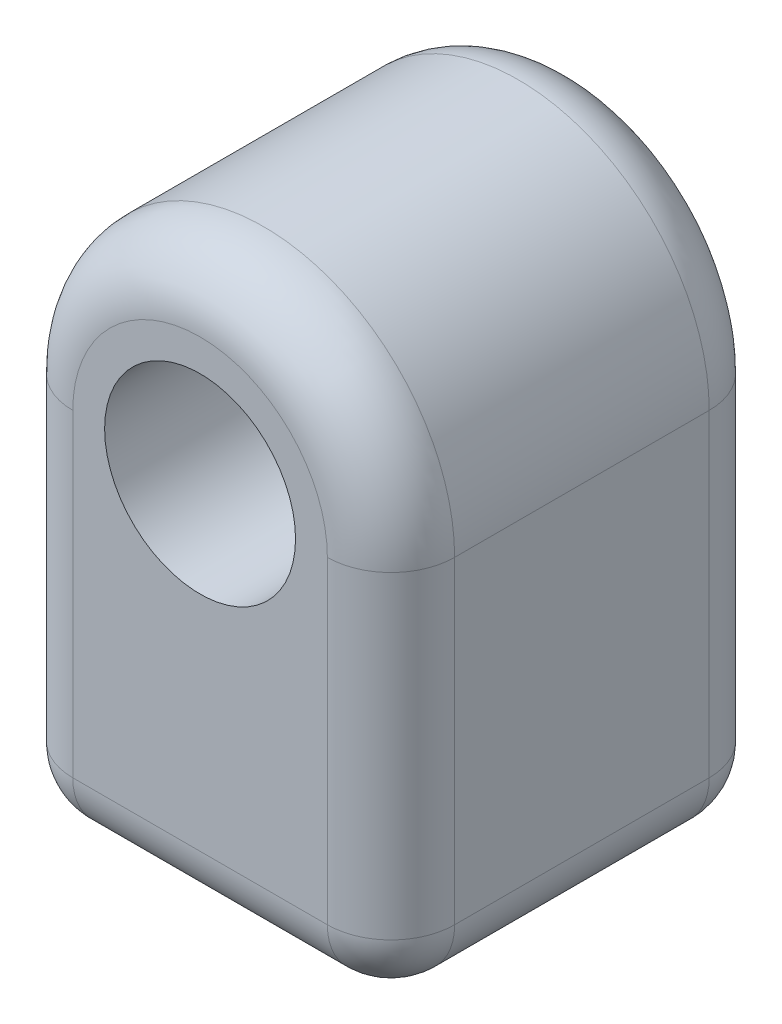
ISO-10303-21;
HEADER;
FILE_DESCRIPTION(('STEP AP214'),'2;1');
FILE_NAME('part.step','',(''),(''),'','','');
FILE_SCHEMA(('AUTOMOTIVE_DESIGN { 1 0 10303 214 1 1 1 1 }'));
ENDSEC;
DATA;
#1=APPLICATION_CONTEXT('core data for automotive mechanical design processes');
#2=APPLICATION_PROTOCOL_DEFINITION('international standard','automotive_design',2000,#1);
#3=PRODUCT_CONTEXT('',#1,'mechanical');
#4=PRODUCT('Part','Part','',(#3));
#5=PRODUCT_RELATED_PRODUCT_CATEGORY('part','',(#4));
#6=PRODUCT_DEFINITION_FORMATION('','',#4);
#7=PRODUCT_DEFINITION_CONTEXT('part definition',#1,'design');
#8=PRODUCT_DEFINITION('design','',#6,#7);
#9=PRODUCT_DEFINITION_SHAPE('','',#8);
#10=(LENGTH_UNIT() NAMED_UNIT(*) SI_UNIT(.MILLI.,.METRE.));
#11=(NAMED_UNIT(*) PLANE_ANGLE_UNIT() SI_UNIT($,.RADIAN.));
#12=(NAMED_UNIT(*) SI_UNIT($,.STERADIAN.) SOLID_ANGLE_UNIT());
#13=UNCERTAINTY_MEASURE_WITH_UNIT(LENGTH_MEASURE(1.E-05),#10,'distance_accuracy_value','');
#14=(GEOMETRIC_REPRESENTATION_CONTEXT(3) GLOBAL_UNCERTAINTY_ASSIGNED_CONTEXT((#13)) GLOBAL_UNIT_ASSIGNED_CONTEXT((#10,
#11,#12)) REPRESENTATION_CONTEXT('',''));
#15=CARTESIAN_POINT('',(0.,0.,0.));
#16=DIRECTION('',(0.,0.,1.));
#17=DIRECTION('',(1.,0.,0.));
#18=AXIS2_PLACEMENT_3D('',#15,#16,#17);
#19=CARTESIAN_POINT('',(0.,0.,6.));
#20=DIRECTION('',(0.,0.,1.));
#21=DIRECTION('',(1.,0.,0.));
#22=AXIS2_PLACEMENT_3D('',#19,#20,#21);
#23=PLANE('',#22);
#24=DIRECTION('',(0.,1.,0.));
#25=VECTOR('',#24,1.);
#26=CARTESIAN_POINT('',(2.,0.,6.));
#27=LINE('',#26,#25);
#28=CARTESIAN_POINT('',(2.,-5.,6.));
#29=VERTEX_POINT('',#28);
#30=CARTESIAN_POINT('',(2.,0.,6.));
#31=VERTEX_POINT('',#30);
#32=EDGE_CURVE('E204',#29,#31,#27,.T.);
#33=ORIENTED_EDGE('',*,*,#32,.T.);
#34=CARTESIAN_POINT('',(0.,0.,6.));
#35=DIRECTION('',(0.,0.,1.));
#36=DIRECTION('',(1.,0.,0.));
#37=AXIS2_PLACEMENT_3D('',#34,#35,#36);
#38=CIRCLE('',#37,2.);
#39=CARTESIAN_POINT('',(-2.,0.,6.));
#40=VERTEX_POINT('',#39);
#41=EDGE_CURVE('E208',#31,#40,#38,.T.);
#42=ORIENTED_EDGE('',*,*,#41,.T.);
#43=DIRECTION('',(0.,-1.,0.));
#44=VECTOR('',#43,1.);
#45=CARTESIAN_POINT('',(-2.,-6.,6.));
#46=LINE('',#45,#44);
#47=CARTESIAN_POINT('',(-2.,-5.,6.));
#48=VERTEX_POINT('',#47);
#49=EDGE_CURVE('E206',#40,#48,#46,.T.);
#50=ORIENTED_EDGE('',*,*,#49,.T.);
#51=DIRECTION('',(1.,0.,0.));
#52=VECTOR('',#51,1.);
#53=CARTESIAN_POINT('',(3.,-5.,6.));
#54=LINE('',#53,#52);
#55=EDGE_CURVE('E202',#48,#29,#54,.T.);
#56=ORIENTED_EDGE('',*,*,#55,.T.);
#57=EDGE_LOOP('',(#33,#42,#50,#56));
#58=FACE_BOUND('',#57,.T.);
#59=CARTESIAN_POINT('',(0.,0.,6.));
#60=DIRECTION('',(0.,0.,1.));
#61=DIRECTION('',(1.,0.,0.));
#62=AXIS2_PLACEMENT_3D('',#59,#60,#61);
#63=CIRCLE('',#62,1.5);
#64=CARTESIAN_POINT('',(1.5,0.,6.));
#65=VERTEX_POINT('',#64);
#66=EDGE_CURVE('E169',#65,#65,#63,.T.);
#67=ORIENTED_EDGE('',*,*,#66,.F.);
#68=EDGE_LOOP('',(#67));
#69=FACE_BOUND('',#68,.T.);
#70=ADVANCED_FACE('F33',(#58,#69),#23,.T.);
#71=CARTESIAN_POINT('',(0.,0.,0.));
#72=DIRECTION('',(0.,0.,1.));
#73=DIRECTION('',(1.,0.,0.));
#74=AXIS2_PLACEMENT_3D('',#71,#72,#73);
#75=PLANE('',#74);
#76=DIRECTION('',(0.,-1.,0.));
#77=VECTOR('',#76,1.);
#78=CARTESIAN_POINT('',(-2.,0.,0.));
#79=LINE('',#78,#77);
#80=CARTESIAN_POINT('',(-2.,-5.,0.));
#81=VERTEX_POINT('',#80);
#82=CARTESIAN_POINT('',(-2.,0.,0.));
#83=VERTEX_POINT('',#82);
#84=EDGE_CURVE('E193',#81,#83,#79,.F.);
#85=ORIENTED_EDGE('',*,*,#84,.T.);
#86=CARTESIAN_POINT('',(0.,0.,0.));
#87=DIRECTION('',(0.,0.,1.));
#88=DIRECTION('',(1.,0.,0.));
#89=AXIS2_PLACEMENT_3D('',#86,#87,#88);
#90=CIRCLE('',#89,2.);
#91=CARTESIAN_POINT('',(2.,0.,0.));
#92=VERTEX_POINT('',#91);
#93=EDGE_CURVE('E199',#83,#92,#90,.F.);
#94=ORIENTED_EDGE('',*,*,#93,.T.);
#95=DIRECTION('',(0.,1.,0.));
#96=VECTOR('',#95,1.);
#97=CARTESIAN_POINT('',(2.,0.,0.));
#98=LINE('',#97,#96);
#99=CARTESIAN_POINT('',(2.,-5.,0.));
#100=VERTEX_POINT('',#99);
#101=EDGE_CURVE('E197',#92,#100,#98,.F.);
#102=ORIENTED_EDGE('',*,*,#101,.T.);
#103=DIRECTION('',(1.,0.,0.));
#104=VECTOR('',#103,1.);
#105=CARTESIAN_POINT('',(0.,-5.,0.));
#106=LINE('',#105,#104);
#107=EDGE_CURVE('E195',#100,#81,#106,.F.);
#108=ORIENTED_EDGE('',*,*,#107,.T.);
#109=EDGE_LOOP('',(#85,#94,#102,#108));
#110=FACE_BOUND('',#109,.T.);
#111=DIRECTION('',(-1.,0.,0.));
#112=VECTOR('',#111,1.);
#113=CARTESIAN_POINT('',(1.25,-3.5,0.));
#114=LINE('',#113,#112);
#115=CARTESIAN_POINT('',(1.25,-3.5,0.));
#116=VERTEX_POINT('',#115);
#117=CARTESIAN_POINT('',(-1.25,-3.5,0.));
#118=VERTEX_POINT('',#117);
#119=EDGE_CURVE('E149',#116,#118,#114,.T.);
#120=ORIENTED_EDGE('',*,*,#119,.F.);
#121=DIRECTION('',(0.,-1.,0.));
#122=VECTOR('',#121,1.);
#123=CARTESIAN_POINT('',(1.25,-2.,0.));
#124=LINE('',#123,#122);
#125=CARTESIAN_POINT('',(1.25,-2.,0.));
#126=VERTEX_POINT('',#125);
#127=EDGE_CURVE('E154',#126,#116,#124,.T.);
#128=ORIENTED_EDGE('',*,*,#127,.F.);
#129=DIRECTION('',(1.,0.,0.));
#130=VECTOR('',#129,1.);
#131=CARTESIAN_POINT('',(1.25,-2.,0.));
#132=LINE('',#131,#130);
#133=CARTESIAN_POINT('',(-1.25,-2.,0.));
#134=VERTEX_POINT('',#133);
#135=EDGE_CURVE('E159',#134,#126,#132,.T.);
#136=ORIENTED_EDGE('',*,*,#135,.F.);
#137=DIRECTION('',(0.,1.,0.));
#138=VECTOR('',#137,1.);
#139=CARTESIAN_POINT('',(-1.25,-2.,0.));
#140=LINE('',#139,#138);
#141=EDGE_CURVE('E138',#118,#134,#140,.T.);
#142=ORIENTED_EDGE('',*,*,#141,.F.);
#143=EDGE_LOOP('',(#120,#128,#136,#142));
#144=FACE_BOUND('',#143,.T.);
#145=CARTESIAN_POINT('',(0.,0.,0.));
#146=DIRECTION('',(0.,0.,1.));
#147=DIRECTION('',(1.,0.,0.));
#148=AXIS2_PLACEMENT_3D('',#145,#146,#147);
#149=CIRCLE('',#148,1.5);
#150=CARTESIAN_POINT('',(1.5,0.,0.));
#151=VERTEX_POINT('',#150);
#152=EDGE_CURVE('E166',#151,#151,#149,.T.);
#153=ORIENTED_EDGE('',*,*,#152,.T.);
#154=EDGE_LOOP('',(#153));
#155=FACE_BOUND('',#154,.T.);
#156=ADVANCED_FACE('F156',(#110,#144,#155),#75,.F.);
#157=CARTESIAN_POINT('',(0.,0.,6.));
#158=DIRECTION('',(0.,0.,-1.));
#159=DIRECTION('',(-1.,0.,0.));
#160=AXIS2_PLACEMENT_3D('',#157,#158,#159);
#161=CYLINDRICAL_SURFACE('',#160,3.);
#162=DIRECTION('',(0.,0.,-1.));
#163=VECTOR('',#162,1.);
#164=CARTESIAN_POINT('',(3.,0.,6.));
#165=LINE('',#164,#163);
#166=CARTESIAN_POINT('',(3.,0.,5.));
#167=VERTEX_POINT('',#166);
#168=CARTESIAN_POINT('',(3.,0.,1.));
#169=VERTEX_POINT('',#168);
#170=EDGE_CURVE('E172',#167,#169,#165,.T.);
#171=ORIENTED_EDGE('',*,*,#170,.T.);
#172=CARTESIAN_POINT('',(0.,0.,1.));
#173=DIRECTION('',(0.,0.,1.));
#174=DIRECTION('',(1.,0.,0.));
#175=AXIS2_PLACEMENT_3D('',#172,#173,#174);
#176=CIRCLE('',#175,3.);
#177=CARTESIAN_POINT('',(-3.,0.,1.));
#178=VERTEX_POINT('',#177);
#179=EDGE_CURVE('E190',#169,#178,#176,.T.);
#180=ORIENTED_EDGE('',*,*,#179,.T.);
#181=DIRECTION('',(0.,0.,-1.));
#182=VECTOR('',#181,1.);
#183=CARTESIAN_POINT('',(-3.,0.,6.));
#184=LINE('',#183,#182);
#185=CARTESIAN_POINT('',(-3.,0.,5.));
#186=VERTEX_POINT('',#185);
#187=EDGE_CURVE('E177',#186,#178,#184,.T.);
#188=ORIENTED_EDGE('',*,*,#187,.F.);
#189=CARTESIAN_POINT('',(0.,0.,5.));
#190=DIRECTION('',(0.,0.,1.));
#191=DIRECTION('',(1.,0.,0.));
#192=AXIS2_PLACEMENT_3D('',#189,#190,#191);
#193=CIRCLE('',#192,3.);
#194=EDGE_CURVE('E188',#186,#167,#193,.F.);
#195=ORIENTED_EDGE('',*,*,#194,.T.);
#196=EDGE_LOOP('',(#171,#180,#188,#195));
#197=FACE_BOUND('',#196,.T.);
#198=ADVANCED_FACE('F294',(#197),#161,.T.);
#199=CARTESIAN_POINT('',(-3.,0.,6.));
#200=DIRECTION('',(1.,0.,0.));
#201=DIRECTION('',(0.,1.,0.));
#202=AXIS2_PLACEMENT_3D('',#199,#200,#201);
#203=PLANE('',#202);
#204=ORIENTED_EDGE('',*,*,#187,.T.);
#205=DIRECTION('',(0.,-1.,0.));
#206=VECTOR('',#205,1.);
#207=CARTESIAN_POINT('',(-3.,0.,1.));
#208=LINE('',#207,#206);
#209=CARTESIAN_POINT('',(-3.,-5.,1.));
#210=VERTEX_POINT('',#209);
#211=EDGE_CURVE('E11',#178,#210,#208,.T.);
#212=ORIENTED_EDGE('',*,*,#211,.T.);
#213=DIRECTION('',(0.,0.,-1.));
#214=VECTOR('',#213,1.);
#215=CARTESIAN_POINT('',(-3.,-5.,6.));
#216=LINE('',#215,#214);
#217=CARTESIAN_POINT('',(-3.,-5.,5.));
#218=VERTEX_POINT('',#217);
#219=EDGE_CURVE('E49',#210,#218,#216,.F.);
#220=ORIENTED_EDGE('',*,*,#219,.T.);
#221=DIRECTION('',(0.,-1.,0.));
#222=VECTOR('',#221,1.);
#223=CARTESIAN_POINT('',(-3.,0.,5.));
#224=LINE('',#223,#222);
#225=EDGE_CURVE('E42',#218,#186,#224,.F.);
#226=ORIENTED_EDGE('',*,*,#225,.T.);
#227=EDGE_LOOP('',(#204,#212,#220,#226));
#228=FACE_BOUND('',#227,.T.);
#229=ADVANCED_FACE('F284',(#228),#203,.F.);
#230=CARTESIAN_POINT('',(-3.,-6.,6.));
#231=DIRECTION('',(0.,1.,0.));
#232=DIRECTION('',(0.,0.,1.));
#233=AXIS2_PLACEMENT_3D('',#230,#231,#232);
#234=PLANE('',#233);
#235=DIRECTION('',(0.,0.,-1.));
#236=VECTOR('',#235,1.);
#237=CARTESIAN_POINT('',(-2.,-6.,6.));
#238=LINE('',#237,#236);
#239=CARTESIAN_POINT('',(-2.,-6.,5.));
#240=VERTEX_POINT('',#239);
#241=CARTESIAN_POINT('',(-2.,-6.,1.));
#242=VERTEX_POINT('',#241);
#243=EDGE_CURVE('E219',#240,#242,#238,.T.);
#244=ORIENTED_EDGE('',*,*,#243,.T.);
#245=DIRECTION('',(1.,0.,0.));
#246=VECTOR('',#245,1.);
#247=CARTESIAN_POINT('',(-3.,-6.,1.));
#248=LINE('',#247,#246);
#249=CARTESIAN_POINT('',(2.,-6.,1.));
#250=VERTEX_POINT('',#249);
#251=EDGE_CURVE('E223',#242,#250,#248,.T.);
#252=ORIENTED_EDGE('',*,*,#251,.T.);
#253=DIRECTION('',(0.,0.,-1.));
#254=VECTOR('',#253,1.);
#255=CARTESIAN_POINT('',(2.,-6.,6.));
#256=LINE('',#255,#254);
#257=CARTESIAN_POINT('',(2.,-6.,5.));
#258=VERTEX_POINT('',#257);
#259=EDGE_CURVE('E221',#250,#258,#256,.F.);
#260=ORIENTED_EDGE('',*,*,#259,.T.);
#261=DIRECTION('',(1.,0.,0.));
#262=VECTOR('',#261,1.);
#263=CARTESIAN_POINT('',(-3.,-6.,5.));
#264=LINE('',#263,#262);
#265=EDGE_CURVE('E217',#258,#240,#264,.F.);
#266=ORIENTED_EDGE('',*,*,#265,.T.);
#267=EDGE_LOOP('',(#244,#252,#260,#266));
#268=FACE_BOUND('',#267,.T.);
#269=DIRECTION('',(1.,0.,0.));
#270=VECTOR('',#269,1.);
#271=CARTESIAN_POINT('',(-3.,-6.,4.00000000000005));
#272=LINE('',#271,#270);
#273=CARTESIAN_POINT('',(-1.25,-6.,4.00000000000005));
#274=VERTEX_POINT('',#273);
#275=CARTESIAN_POINT('',(1.25,-6.,4.00000000000005));
#276=VERTEX_POINT('',#275);
#277=EDGE_CURVE('E182',#274,#276,#272,.T.);
#278=ORIENTED_EDGE('',*,*,#277,.T.);
#279=DIRECTION('',(0.,0.,-1.));
#280=VECTOR('',#279,1.);
#281=CARTESIAN_POINT('',(1.25,-6.,6.));
#282=LINE('',#281,#280);
#283=CARTESIAN_POINT('',(1.25,-6.,2.50000000000003));
#284=VERTEX_POINT('',#283);
#285=EDGE_CURVE('E185',#276,#284,#282,.T.);
#286=ORIENTED_EDGE('',*,*,#285,.T.);
#287=DIRECTION('',(-1.,0.,0.));
#288=VECTOR('',#287,1.);
#289=CARTESIAN_POINT('',(-3.,-6.,2.50000000000003));
#290=LINE('',#289,#288);
#291=CARTESIAN_POINT('',(-1.25,-6.,2.50000000000003));
#292=VERTEX_POINT('',#291);
#293=EDGE_CURVE('E179',#284,#292,#290,.T.);
#294=ORIENTED_EDGE('',*,*,#293,.T.);
#295=DIRECTION('',(0.,0.,1.));
#296=VECTOR('',#295,1.);
#297=CARTESIAN_POINT('',(-1.25,-6.,6.));
#298=LINE('',#297,#296);
#299=EDGE_CURVE('E141',#292,#274,#298,.T.);
#300=ORIENTED_EDGE('',*,*,#299,.T.);
#301=EDGE_LOOP('',(#278,#286,#294,#300));
#302=FACE_BOUND('',#301,.T.);
#303=ADVANCED_FACE('F281',(#268,#302),#234,.F.);
#304=CARTESIAN_POINT('',(3.,-6.,6.));
#305=DIRECTION('',(-1.,0.,0.));
#306=DIRECTION('',(0.,-1.,0.));
#307=AXIS2_PLACEMENT_3D('',#304,#305,#306);
#308=PLANE('',#307);
#309=DIRECTION('',(0.,0.,-1.));
#310=VECTOR('',#309,1.);
#311=CARTESIAN_POINT('',(3.,-5.,6.));
#312=LINE('',#311,#310);
#313=CARTESIAN_POINT('',(3.,-5.,5.));
#314=VERTEX_POINT('',#313);
#315=CARTESIAN_POINT('',(3.,-5.,1.));
#316=VERTEX_POINT('',#315);
#317=EDGE_CURVE('E211',#314,#316,#312,.T.);
#318=ORIENTED_EDGE('',*,*,#317,.T.);
#319=DIRECTION('',(0.,1.,0.));
#320=VECTOR('',#319,1.);
#321=CARTESIAN_POINT('',(3.,-6.,1.));
#322=LINE('',#321,#320);
#323=EDGE_CURVE('E215',#316,#169,#322,.T.);
#324=ORIENTED_EDGE('',*,*,#323,.T.);
#325=ORIENTED_EDGE('',*,*,#170,.F.);
#326=DIRECTION('',(0.,1.,0.));
#327=VECTOR('',#326,1.);
#328=CARTESIAN_POINT('',(3.,-6.,5.));
#329=LINE('',#328,#327);
#330=EDGE_CURVE('E213',#167,#314,#329,.F.);
#331=ORIENTED_EDGE('',*,*,#330,.T.);
#332=EDGE_LOOP('',(#318,#324,#325,#331));
#333=FACE_BOUND('',#332,.T.);
#334=ADVANCED_FACE('F283',(#333),#308,.F.);
#335=CARTESIAN_POINT('',(0.,0.,6.));
#336=DIRECTION('',(0.,0.,-1.));
#337=DIRECTION('',(-1.,0.,0.));
#338=AXIS2_PLACEMENT_3D('',#335,#336,#337);
#339=CYLINDRICAL_SURFACE('',#338,1.5);
#340=ORIENTED_EDGE('',*,*,#66,.T.);
#341=EDGE_LOOP('',(#340));
#342=FACE_BOUND('',#341,.T.);
#343=ORIENTED_EDGE('',*,*,#152,.F.);
#344=EDGE_LOOP('',(#343));
#345=FACE_BOUND('',#344,.T.);
#346=ADVANCED_FACE('F291',(#342,#345),#339,.F.);
#347=CARTESIAN_POINT('',(1.25,-6.24264068711926,4.24264068711931));
#348=DIRECTION('',(1.,0.,0.));
#349=DIRECTION('',(0.,1.,0.));
#350=AXIS2_PLACEMENT_3D('',#347,#348,#349);
#351=PLANE('',#350);
#352=DIRECTION('',(0.,0.707106781186544,-0.707106781186551));
#353=VECTOR('',#352,1.);
#354=CARTESIAN_POINT('',(1.25,-6.24264068711926,4.24264068711931));
#355=LINE('',#354,#353);
#356=EDGE_CURVE('E164',#276,#126,#355,.T.);
#357=ORIENTED_EDGE('',*,*,#356,.T.);
#358=ORIENTED_EDGE('',*,*,#127,.T.);
#359=DIRECTION('',(0.,0.707106781186544,-0.707106781186551));
#360=VECTOR('',#359,1.);
#361=CARTESIAN_POINT('',(1.25,-7.74264068711926,4.24264068711931));
#362=LINE('',#361,#360);
#363=EDGE_CURVE('E145',#284,#116,#362,.T.);
#364=ORIENTED_EDGE('',*,*,#363,.F.);
#365=ORIENTED_EDGE('',*,*,#285,.F.);
#366=EDGE_LOOP('',(#357,#358,#364,#365));
#367=FACE_BOUND('',#366,.T.);
#368=ADVANCED_FACE('F276',(#367),#351,.F.);
#369=CARTESIAN_POINT('',(1.25,-6.24264068711926,4.24264068711931));
#370=DIRECTION('',(0.,0.707106781186551,0.707106781186544));
#371=DIRECTION('',(0.,-0.707106781186544,0.707106781186551));
#372=AXIS2_PLACEMENT_3D('',#369,#370,#371);
#373=PLANE('',#372);
#374=DIRECTION('',(0.,0.707106781186544,-0.707106781186551));
#375=VECTOR('',#374,1.);
#376=CARTESIAN_POINT('',(-1.25,-6.24264068711926,4.24264068711931));
#377=LINE('',#376,#375);
#378=EDGE_CURVE('E144',#274,#134,#377,.T.);
#379=ORIENTED_EDGE('',*,*,#378,.T.);
#380=ORIENTED_EDGE('',*,*,#135,.T.);
#381=ORIENTED_EDGE('',*,*,#356,.F.);
#382=ORIENTED_EDGE('',*,*,#277,.F.);
#383=EDGE_LOOP('',(#379,#380,#381,#382));
#384=FACE_BOUND('',#383,.T.);
#385=ADVANCED_FACE('F279',(#384),#373,.F.);
#386=CARTESIAN_POINT('',(-1.25,-6.24264068711926,4.24264068711931));
#387=DIRECTION('',(-1.,0.,0.));
#388=DIRECTION('',(0.,-1.,0.));
#389=AXIS2_PLACEMENT_3D('',#386,#387,#388);
#390=PLANE('',#389);
#391=DIRECTION('',(0.,0.707106781186544,-0.707106781186551));
#392=VECTOR('',#391,1.);
#393=CARTESIAN_POINT('',(-1.25,-7.74264068711926,4.24264068711931));
#394=LINE('',#393,#392);
#395=EDGE_CURVE('E133',#292,#118,#394,.T.);
#396=ORIENTED_EDGE('',*,*,#395,.T.);
#397=ORIENTED_EDGE('',*,*,#141,.T.);
#398=ORIENTED_EDGE('',*,*,#378,.F.);
#399=ORIENTED_EDGE('',*,*,#299,.F.);
#400=EDGE_LOOP('',(#396,#397,#398,#399));
#401=FACE_BOUND('',#400,.T.);
#402=ADVANCED_FACE('F135',(#401),#390,.F.);
#403=CARTESIAN_POINT('',(1.25,-7.74264068711926,4.24264068711931));
#404=DIRECTION('',(0.,-0.707106781186551,-0.707106781186544));
#405=DIRECTION('',(0.,0.707106781186544,-0.707106781186551));
#406=AXIS2_PLACEMENT_3D('',#403,#404,#405);
#407=PLANE('',#406);
#408=ORIENTED_EDGE('',*,*,#363,.T.);
#409=ORIENTED_EDGE('',*,*,#119,.T.);
#410=ORIENTED_EDGE('',*,*,#395,.F.);
#411=ORIENTED_EDGE('',*,*,#293,.F.);
#412=EDGE_LOOP('',(#408,#409,#410,#411));
#413=FACE_BOUND('',#412,.T.);
#414=ADVANCED_FACE('F150',(#413),#407,.F.);
#415=CARTESIAN_POINT('',(0.,0.,5.));
#416=DIRECTION('',(0.,0.,1.));
#417=DIRECTION('',(1.,0.,0.));
#418=AXIS2_PLACEMENT_3D('',#415,#416,#417);
#419=TOROIDAL_SURFACE('',#418,2.,1.);
#420=CARTESIAN_POINT('',(-2.,0.,5.));
#421=DIRECTION('',(0.,-1.,0.));
#422=DIRECTION('',(0.,0.,-1.));
#423=AXIS2_PLACEMENT_3D('',#420,#421,#422);
#424=CIRCLE('',#423,1.);
#425=EDGE_CURVE('E266',#40,#186,#424,.T.);
#426=ORIENTED_EDGE('',*,*,#425,.F.);
#427=ORIENTED_EDGE('',*,*,#41,.F.);
#428=CARTESIAN_POINT('',(2.,0.,5.));
#429=DIRECTION('',(0.,-1.,0.));
#430=DIRECTION('',(0.,0.,-1.));
#431=AXIS2_PLACEMENT_3D('',#428,#429,#430);
#432=CIRCLE('',#431,1.);
#433=EDGE_CURVE('E37',#167,#31,#432,.T.);
#434=ORIENTED_EDGE('',*,*,#433,.F.);
#435=ORIENTED_EDGE('',*,*,#194,.F.);
#436=EDGE_LOOP('',(#426,#427,#434,#435));
#437=FACE_BOUND('',#436,.T.);
#438=ADVANCED_FACE('F35',(#437),#419,.T.);
#439=CARTESIAN_POINT('',(2.,0.,5.));
#440=DIRECTION('',(0.,-1.,0.));
#441=DIRECTION('',(1.,0.,0.));
#442=AXIS2_PLACEMENT_3D('',#439,#440,#441);
#443=CYLINDRICAL_SURFACE('',#442,1.);
#444=ORIENTED_EDGE('',*,*,#433,.T.);
#445=ORIENTED_EDGE('',*,*,#32,.F.);
#446=CARTESIAN_POINT('',(2.,-5.,5.));
#447=DIRECTION('',(0.,-1.,0.));
#448=DIRECTION('',(0.,0.,-1.));
#449=AXIS2_PLACEMENT_3D('',#446,#447,#448);
#450=CIRCLE('',#449,1.);
#451=EDGE_CURVE('E261',#314,#29,#450,.T.);
#452=ORIENTED_EDGE('',*,*,#451,.F.);
#453=ORIENTED_EDGE('',*,*,#330,.F.);
#454=EDGE_LOOP('',(#444,#445,#452,#453));
#455=FACE_BOUND('',#454,.T.);
#456=ADVANCED_FACE('F334',(#455),#443,.T.);
#457=CARTESIAN_POINT('',(-2.,0.,5.));
#458=DIRECTION('',(0.,1.,0.));
#459=DIRECTION('',(-1.,0.,0.));
#460=AXIS2_PLACEMENT_3D('',#457,#458,#459);
#461=CYLINDRICAL_SURFACE('',#460,1.);
#462=ORIENTED_EDGE('',*,*,#425,.T.);
#463=ORIENTED_EDGE('',*,*,#225,.F.);
#464=CARTESIAN_POINT('',(-2.,-5.,5.));
#465=DIRECTION('',(0.,-1.,0.));
#466=DIRECTION('',(0.,0.,-1.));
#467=AXIS2_PLACEMENT_3D('',#464,#465,#466);
#468=CIRCLE('',#467,1.);
#469=EDGE_CURVE('E258',#48,#218,#468,.T.);
#470=ORIENTED_EDGE('',*,*,#469,.F.);
#471=ORIENTED_EDGE('',*,*,#49,.F.);
#472=EDGE_LOOP('',(#462,#463,#470,#471));
#473=FACE_BOUND('',#472,.T.);
#474=ADVANCED_FACE('F342',(#473),#461,.T.);
#475=CARTESIAN_POINT('',(0.,-5.,5.));
#476=DIRECTION('',(-1.,0.,0.));
#477=DIRECTION('',(0.,0.,1.));
#478=AXIS2_PLACEMENT_3D('',#475,#476,#477);
#479=CYLINDRICAL_SURFACE('',#478,1.);
#480=CARTESIAN_POINT('',(2.,-5.,5.));
#481=DIRECTION('',(1.,0.,0.));
#482=DIRECTION('',(0.,0.,-1.));
#483=AXIS2_PLACEMENT_3D('',#480,#481,#482);
#484=CIRCLE('',#483,1.);
#485=EDGE_CURVE('E264',#29,#258,#484,.T.);
#486=ORIENTED_EDGE('',*,*,#485,.F.);
#487=ORIENTED_EDGE('',*,*,#55,.F.);
#488=CARTESIAN_POINT('',(-2.,-5.,5.));
#489=DIRECTION('',(-1.,0.,0.));
#490=DIRECTION('',(0.,0.,1.));
#491=AXIS2_PLACEMENT_3D('',#488,#489,#490);
#492=CIRCLE('',#491,1.);
#493=EDGE_CURVE('E255',#240,#48,#492,.T.);
#494=ORIENTED_EDGE('',*,*,#493,.F.);
#495=ORIENTED_EDGE('',*,*,#265,.F.);
#496=EDGE_LOOP('',(#486,#487,#494,#495));
#497=FACE_BOUND('',#496,.T.);
#498=ADVANCED_FACE('F348',(#497),#479,.T.);
#499=CARTESIAN_POINT('',(2.,-5.,5.));
#500=DIRECTION('',(0.,0.,1.));
#501=DIRECTION('',(1.,0.,0.));
#502=AXIS2_PLACEMENT_3D('',#499,#500,#501);
#503=SPHERICAL_SURFACE('',#502,1.);
#504=ORIENTED_EDGE('',*,*,#451,.T.);
#505=ORIENTED_EDGE('',*,*,#485,.T.);
#506=CARTESIAN_POINT('',(2.,-5.,5.));
#507=DIRECTION('',(0.,0.,1.));
#508=DIRECTION('',(1.,0.,0.));
#509=AXIS2_PLACEMENT_3D('',#506,#507,#508);
#510=CIRCLE('',#509,1.);
#511=EDGE_CURVE('E252',#314,#258,#510,.F.);
#512=ORIENTED_EDGE('',*,*,#511,.F.);
#513=EDGE_LOOP('',(#504,#505,#512));
#514=FACE_BOUND('',#513,.T.);
#515=ADVANCED_FACE('F355',(#514),#503,.T.);
#516=CARTESIAN_POINT('',(-2.,-5.,5.));
#517=DIRECTION('',(0.,0.,1.));
#518=DIRECTION('',(1.,0.,0.));
#519=AXIS2_PLACEMENT_3D('',#516,#517,#518);
#520=SPHERICAL_SURFACE('',#519,1.);
#521=ORIENTED_EDGE('',*,*,#493,.T.);
#522=ORIENTED_EDGE('',*,*,#469,.T.);
#523=CARTESIAN_POINT('',(-2.,-5.,5.));
#524=DIRECTION('',(0.,0.,1.));
#525=DIRECTION('',(1.,0.,0.));
#526=AXIS2_PLACEMENT_3D('',#523,#524,#525);
#527=CIRCLE('',#526,1.);
#528=EDGE_CURVE('E249',#240,#218,#527,.F.);
#529=ORIENTED_EDGE('',*,*,#528,.F.);
#530=EDGE_LOOP('',(#521,#522,#529));
#531=FACE_BOUND('',#530,.T.);
#532=ADVANCED_FACE('F363',(#531),#520,.T.);
#533=CARTESIAN_POINT('',(2.,-5.,6.));
#534=DIRECTION('',(0.,0.,-1.));
#535=DIRECTION('',(-1.,0.,0.));
#536=AXIS2_PLACEMENT_3D('',#533,#534,#535);
#537=CYLINDRICAL_SURFACE('',#536,1.);
#538=ORIENTED_EDGE('',*,*,#511,.T.);
#539=ORIENTED_EDGE('',*,*,#259,.F.);
#540=CARTESIAN_POINT('',(2.,-5.,1.));
#541=DIRECTION('',(0.,0.,-1.));
#542=DIRECTION('',(-1.,0.,0.));
#543=AXIS2_PLACEMENT_3D('',#540,#541,#542);
#544=CIRCLE('',#543,1.);
#545=EDGE_CURVE('E244',#316,#250,#544,.T.);
#546=ORIENTED_EDGE('',*,*,#545,.F.);
#547=ORIENTED_EDGE('',*,*,#317,.F.);
#548=EDGE_LOOP('',(#538,#539,#546,#547));
#549=FACE_BOUND('',#548,.T.);
#550=ADVANCED_FACE('F371',(#549),#537,.T.);
#551=CARTESIAN_POINT('',(-2.,-5.,6.));
#552=DIRECTION('',(0.,0.,-1.));
#553=DIRECTION('',(-1.,0.,0.));
#554=AXIS2_PLACEMENT_3D('',#551,#552,#553);
#555=CYLINDRICAL_SURFACE('',#554,1.);
#556=ORIENTED_EDGE('',*,*,#528,.T.);
#557=ORIENTED_EDGE('',*,*,#219,.F.);
#558=CARTESIAN_POINT('',(-2.,-5.,1.));
#559=DIRECTION('',(0.,0.,-1.));
#560=DIRECTION('',(-1.,0.,0.));
#561=AXIS2_PLACEMENT_3D('',#558,#559,#560);
#562=CIRCLE('',#561,1.);
#563=EDGE_CURVE('E241',#242,#210,#562,.T.);
#564=ORIENTED_EDGE('',*,*,#563,.F.);
#565=ORIENTED_EDGE('',*,*,#243,.F.);
#566=EDGE_LOOP('',(#556,#557,#564,#565));
#567=FACE_BOUND('',#566,.T.);
#568=ADVANCED_FACE('F379',(#567),#555,.T.);
#569=CARTESIAN_POINT('',(-3.,-5.,1.));
#570=DIRECTION('',(1.,0.,0.));
#571=DIRECTION('',(0.,0.,-1.));
#572=AXIS2_PLACEMENT_3D('',#569,#570,#571);
#573=CYLINDRICAL_SURFACE('',#572,1.);
#574=CARTESIAN_POINT('',(2.,-5.,1.));
#575=DIRECTION('',(1.,0.,0.));
#576=DIRECTION('',(0.,0.,-1.));
#577=AXIS2_PLACEMENT_3D('',#574,#575,#576);
#578=CIRCLE('',#577,1.);
#579=EDGE_CURVE('E246',#250,#100,#578,.T.);
#580=ORIENTED_EDGE('',*,*,#579,.F.);
#581=ORIENTED_EDGE('',*,*,#251,.F.);
#582=CARTESIAN_POINT('',(-2.,-5.,1.));
#583=DIRECTION('',(-1.,0.,0.));
#584=DIRECTION('',(0.,0.,1.));
#585=AXIS2_PLACEMENT_3D('',#582,#583,#584);
#586=CIRCLE('',#585,1.);
#587=EDGE_CURVE('E238',#81,#242,#586,.T.);
#588=ORIENTED_EDGE('',*,*,#587,.F.);
#589=ORIENTED_EDGE('',*,*,#107,.F.);
#590=EDGE_LOOP('',(#580,#581,#588,#589));
#591=FACE_BOUND('',#590,.T.);
#592=ADVANCED_FACE('F387',(#591),#573,.T.);
#593=CARTESIAN_POINT('',(2.,-5.,1.));
#594=DIRECTION('',(0.,0.,1.));
#595=DIRECTION('',(1.,0.,0.));
#596=AXIS2_PLACEMENT_3D('',#593,#594,#595);
#597=SPHERICAL_SURFACE('',#596,1.);
#598=ORIENTED_EDGE('',*,*,#545,.T.);
#599=ORIENTED_EDGE('',*,*,#579,.T.);
#600=CARTESIAN_POINT('',(2.,-5.,1.));
#601=DIRECTION('',(0.,-1.,0.));
#602=DIRECTION('',(0.,0.,-1.));
#603=AXIS2_PLACEMENT_3D('',#600,#601,#602);
#604=CIRCLE('',#603,1.);
#605=EDGE_CURVE('E235',#316,#100,#604,.F.);
#606=ORIENTED_EDGE('',*,*,#605,.F.);
#607=EDGE_LOOP('',(#598,#599,#606));
#608=FACE_BOUND('',#607,.T.);
#609=ADVANCED_FACE('F395',(#608),#597,.T.);
#610=CARTESIAN_POINT('',(-2.,-5.,1.));
#611=DIRECTION('',(0.,0.,1.));
#612=DIRECTION('',(1.,0.,0.));
#613=AXIS2_PLACEMENT_3D('',#610,#611,#612);
#614=SPHERICAL_SURFACE('',#613,1.);
#615=ORIENTED_EDGE('',*,*,#587,.T.);
#616=ORIENTED_EDGE('',*,*,#563,.T.);
#617=CARTESIAN_POINT('',(-2.,-5.,1.));
#618=DIRECTION('',(0.,-1.,0.));
#619=DIRECTION('',(0.,0.,-1.));
#620=AXIS2_PLACEMENT_3D('',#617,#618,#619);
#621=CIRCLE('',#620,1.);
#622=EDGE_CURVE('E232',#81,#210,#621,.F.);
#623=ORIENTED_EDGE('',*,*,#622,.F.);
#624=EDGE_LOOP('',(#615,#616,#623));
#625=FACE_BOUND('',#624,.T.);
#626=ADVANCED_FACE('F403',(#625),#614,.T.);
#627=CARTESIAN_POINT('',(2.,-6.,1.));
#628=DIRECTION('',(0.,1.,0.));
#629=DIRECTION('',(-1.,0.,0.));
#630=AXIS2_PLACEMENT_3D('',#627,#628,#629);
#631=CYLINDRICAL_SURFACE('',#630,1.);
#632=ORIENTED_EDGE('',*,*,#605,.T.);
#633=ORIENTED_EDGE('',*,*,#101,.F.);
#634=CARTESIAN_POINT('',(2.,0.,1.));
#635=DIRECTION('',(0.,1.,0.));
#636=DIRECTION('',(0.,0.,1.));
#637=AXIS2_PLACEMENT_3D('',#634,#635,#636);
#638=CIRCLE('',#637,1.);
#639=EDGE_CURVE('E230',#169,#92,#638,.T.);
#640=ORIENTED_EDGE('',*,*,#639,.F.);
#641=ORIENTED_EDGE('',*,*,#323,.F.);
#642=EDGE_LOOP('',(#632,#633,#640,#641));
#643=FACE_BOUND('',#642,.T.);
#644=ADVANCED_FACE('F411',(#643),#631,.T.);
#645=CARTESIAN_POINT('',(-2.,0.,1.));
#646=DIRECTION('',(0.,-1.,0.));
#647=DIRECTION('',(1.,0.,0.));
#648=AXIS2_PLACEMENT_3D('',#645,#646,#647);
#649=CYLINDRICAL_SURFACE('',#648,1.);
#650=ORIENTED_EDGE('',*,*,#622,.T.);
#651=ORIENTED_EDGE('',*,*,#211,.F.);
#652=CARTESIAN_POINT('',(-2.,0.,1.));
#653=DIRECTION('',(0.,1.,0.));
#654=DIRECTION('',(0.,0.,1.));
#655=AXIS2_PLACEMENT_3D('',#652,#653,#654);
#656=CIRCLE('',#655,1.);
#657=EDGE_CURVE('E228',#83,#178,#656,.T.);
#658=ORIENTED_EDGE('',*,*,#657,.F.);
#659=ORIENTED_EDGE('',*,*,#84,.F.);
#660=EDGE_LOOP('',(#650,#651,#658,#659));
#661=FACE_BOUND('',#660,.T.);
#662=ADVANCED_FACE('F419',(#661),#649,.T.);
#663=CARTESIAN_POINT('',(0.,0.,1.));
#664=DIRECTION('',(0.,0.,1.));
#665=DIRECTION('',(1.,0.,0.));
#666=AXIS2_PLACEMENT_3D('',#663,#664,#665);
#667=TOROIDAL_SURFACE('',#666,2.,1.);
#668=ORIENTED_EDGE('',*,*,#639,.T.);
#669=ORIENTED_EDGE('',*,*,#93,.F.);
#670=ORIENTED_EDGE('',*,*,#657,.T.);
#671=ORIENTED_EDGE('',*,*,#179,.F.);
#672=EDGE_LOOP('',(#668,#669,#670,#671));
#673=FACE_BOUND('',#672,.T.);
#674=ADVANCED_FACE('F427',(#673),#667,.T.);
#675=CLOSED_SHELL('',(#70,#156,#198,#229,#303,#334,#346,#368,#385,#402,#414,#438,#456,#474,#498,
#515,#532,#550,#568,#592,#609,#626,#644,#662,#674));
#676=MANIFOLD_SOLID_BREP('B2',#675);
#677=ADVANCED_BREP_SHAPE_REPRESENTATION('',(#18,#676),#14);
#678=SHAPE_DEFINITION_REPRESENTATION(#9,#677);
ENDSEC;
END-ISO-10303-21;
